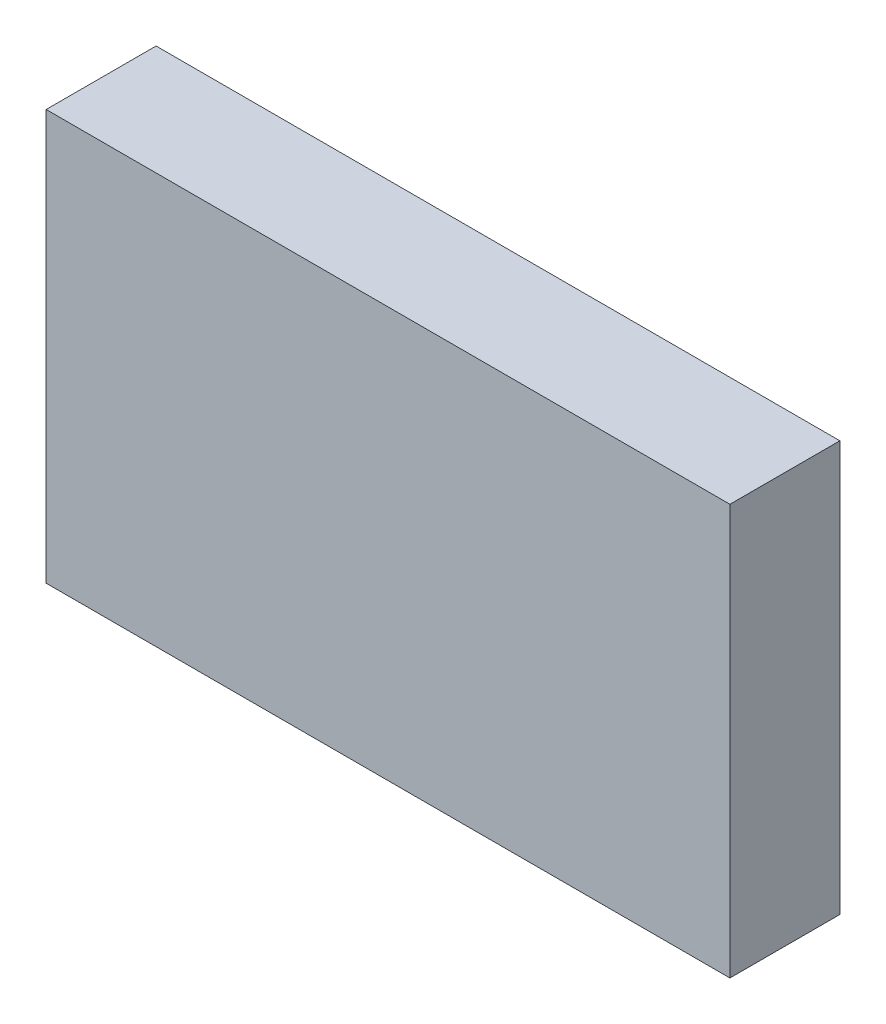
ISO-10303-21;
HEADER;
FILE_DESCRIPTION(('STEP AP214'),'2;1');
FILE_NAME('part.step','',(''),(''),'','','');
FILE_SCHEMA(('AUTOMOTIVE_DESIGN { 1 0 10303 214 1 1 1 1 }'));
ENDSEC;
DATA;
#1=APPLICATION_CONTEXT('core data for automotive mechanical design processes');
#2=APPLICATION_PROTOCOL_DEFINITION('international standard','automotive_design',2000,#1);
#3=PRODUCT_CONTEXT('',#1,'mechanical');
#4=PRODUCT('Part','Part','',(#3));
#5=PRODUCT_RELATED_PRODUCT_CATEGORY('part','',(#4));
#6=PRODUCT_DEFINITION_FORMATION('','',#4);
#7=PRODUCT_DEFINITION_CONTEXT('part definition',#1,'design');
#8=PRODUCT_DEFINITION('design','',#6,#7);
#9=PRODUCT_DEFINITION_SHAPE('','',#8);
#10=(LENGTH_UNIT() NAMED_UNIT(*) SI_UNIT(.MILLI.,.METRE.));
#11=(NAMED_UNIT(*) PLANE_ANGLE_UNIT() SI_UNIT($,.RADIAN.));
#12=(NAMED_UNIT(*) SI_UNIT($,.STERADIAN.) SOLID_ANGLE_UNIT());
#13=UNCERTAINTY_MEASURE_WITH_UNIT(LENGTH_MEASURE(1.E-05),#10,'distance_accuracy_value','');
#14=(GEOMETRIC_REPRESENTATION_CONTEXT(3) GLOBAL_UNCERTAINTY_ASSIGNED_CONTEXT((#13)) GLOBAL_UNIT_ASSIGNED_CONTEXT((#10,
#11,#12)) REPRESENTATION_CONTEXT('',''));
#15=CARTESIAN_POINT('',(0.,0.,0.));
#16=DIRECTION('',(0.,0.,1.));
#17=DIRECTION('',(1.,0.,0.));
#18=AXIS2_PLACEMENT_3D('',#15,#16,#17);
#19=CARTESIAN_POINT('',(12.5,7.5,4.02));
#20=DIRECTION('',(-1.,0.,0.));
#21=DIRECTION('',(0.,0.,1.));
#22=AXIS2_PLACEMENT_3D('',#19,#20,#21);
#23=PLANE('',#22);
#24=DIRECTION('',(0.,1.,0.));
#25=VECTOR('',#24,1.);
#26=CARTESIAN_POINT('',(12.5,7.5,0.));
#27=LINE('',#26,#25);
#28=CARTESIAN_POINT('',(12.5,-7.5,0.));
#29=VERTEX_POINT('',#28);
#30=CARTESIAN_POINT('',(12.5,7.5,0.));
#31=VERTEX_POINT('',#30);
#32=EDGE_CURVE('E96',#29,#31,#27,.T.);
#33=ORIENTED_EDGE('',*,*,#32,.T.);
#34=DIRECTION('',(0.,0.,-1.));
#35=VECTOR('',#34,1.);
#36=CARTESIAN_POINT('',(12.5,7.5,4.02));
#37=LINE('',#36,#35);
#38=CARTESIAN_POINT('',(12.5,7.5,4.02));
#39=VERTEX_POINT('',#38);
#40=EDGE_CURVE('E11',#39,#31,#37,.T.);
#41=ORIENTED_EDGE('',*,*,#40,.F.);
#42=DIRECTION('',(0.,1.,0.));
#43=VECTOR('',#42,1.);
#44=CARTESIAN_POINT('',(12.5,7.5,4.02));
#45=LINE('',#44,#43);
#46=CARTESIAN_POINT('',(12.5,-7.5,4.02));
#47=VERTEX_POINT('',#46);
#48=EDGE_CURVE('E84',#47,#39,#45,.T.);
#49=ORIENTED_EDGE('',*,*,#48,.F.);
#50=DIRECTION('',(0.,0.,-1.));
#51=VECTOR('',#50,1.);
#52=CARTESIAN_POINT('',(12.5,-7.5,4.02));
#53=LINE('',#52,#51);
#54=EDGE_CURVE('E92',#47,#29,#53,.T.);
#55=ORIENTED_EDGE('',*,*,#54,.T.);
#56=EDGE_LOOP('',(#33,#41,#49,#55));
#57=FACE_BOUND('',#56,.T.);
#58=ADVANCED_FACE('F33',(#57),#23,.F.);
#59=CARTESIAN_POINT('',(-12.5,7.5,4.02));
#60=DIRECTION('',(0.,-1.,0.));
#61=DIRECTION('',(0.,0.,-1.));
#62=AXIS2_PLACEMENT_3D('',#59,#60,#61);
#63=PLANE('',#62);
#64=DIRECTION('',(-1.,0.,0.));
#65=VECTOR('',#64,1.);
#66=CARTESIAN_POINT('',(-12.5,7.5,0.));
#67=LINE('',#66,#65);
#68=CARTESIAN_POINT('',(-12.5,7.5,0.));
#69=VERTEX_POINT('',#68);
#70=EDGE_CURVE('E88',#31,#69,#67,.T.);
#71=ORIENTED_EDGE('',*,*,#70,.T.);
#72=DIRECTION('',(0.,0.,-1.));
#73=VECTOR('',#72,1.);
#74=CARTESIAN_POINT('',(-12.5,7.5,4.02));
#75=LINE('',#74,#73);
#76=CARTESIAN_POINT('',(-12.5,7.5,4.02));
#77=VERTEX_POINT('',#76);
#78=EDGE_CURVE('E41',#77,#69,#75,.T.);
#79=ORIENTED_EDGE('',*,*,#78,.F.);
#80=DIRECTION('',(-1.,0.,0.));
#81=VECTOR('',#80,1.);
#82=CARTESIAN_POINT('',(-12.5,7.5,4.02));
#83=LINE('',#82,#81);
#84=EDGE_CURVE('E79',#39,#77,#83,.T.);
#85=ORIENTED_EDGE('',*,*,#84,.F.);
#86=ORIENTED_EDGE('',*,*,#40,.T.);
#87=EDGE_LOOP('',(#71,#79,#85,#86));
#88=FACE_BOUND('',#87,.T.);
#89=ADVANCED_FACE('F87',(#88),#63,.F.);
#90=CARTESIAN_POINT('',(-12.5,7.5,4.02));
#91=DIRECTION('',(1.,0.,0.));
#92=DIRECTION('',(0.,1.,0.));
#93=AXIS2_PLACEMENT_3D('',#90,#91,#92);
#94=PLANE('',#93);
#95=DIRECTION('',(0.,-1.,0.));
#96=VECTOR('',#95,1.);
#97=CARTESIAN_POINT('',(-12.5,7.5,0.));
#98=LINE('',#97,#96);
#99=CARTESIAN_POINT('',(-12.5,-7.5,0.));
#100=VERTEX_POINT('',#99);
#101=EDGE_CURVE('E66',#69,#100,#98,.T.);
#102=ORIENTED_EDGE('',*,*,#101,.T.);
#103=DIRECTION('',(0.,0.,-1.));
#104=VECTOR('',#103,1.);
#105=CARTESIAN_POINT('',(-12.5,-7.5,4.02));
#106=LINE('',#105,#104);
#107=CARTESIAN_POINT('',(-12.5,-7.5,4.02));
#108=VERTEX_POINT('',#107);
#109=EDGE_CURVE('E89',#108,#100,#106,.T.);
#110=ORIENTED_EDGE('',*,*,#109,.F.);
#111=DIRECTION('',(0.,-1.,0.));
#112=VECTOR('',#111,1.);
#113=CARTESIAN_POINT('',(-12.5,7.5,4.02));
#114=LINE('',#113,#112);
#115=EDGE_CURVE('E82',#77,#108,#114,.T.);
#116=ORIENTED_EDGE('',*,*,#115,.F.);
#117=ORIENTED_EDGE('',*,*,#78,.T.);
#118=EDGE_LOOP('',(#102,#110,#116,#117));
#119=FACE_BOUND('',#118,.T.);
#120=ADVANCED_FACE('F90',(#119),#94,.F.);
#121=CARTESIAN_POINT('',(-12.5,-7.5,4.02));
#122=DIRECTION('',(0.,1.,0.));
#123=DIRECTION('',(0.,0.,1.));
#124=AXIS2_PLACEMENT_3D('',#121,#122,#123);
#125=PLANE('',#124);
#126=DIRECTION('',(1.,0.,0.));
#127=VECTOR('',#126,1.);
#128=CARTESIAN_POINT('',(-12.5,-7.5,0.));
#129=LINE('',#128,#127);
#130=EDGE_CURVE('E72',#100,#29,#129,.T.);
#131=ORIENTED_EDGE('',*,*,#130,.T.);
#132=ORIENTED_EDGE('',*,*,#54,.F.);
#133=DIRECTION('',(1.,0.,0.));
#134=VECTOR('',#133,1.);
#135=CARTESIAN_POINT('',(-12.5,-7.5,4.02));
#136=LINE('',#135,#134);
#137=EDGE_CURVE('E49',#108,#47,#136,.T.);
#138=ORIENTED_EDGE('',*,*,#137,.F.);
#139=ORIENTED_EDGE('',*,*,#109,.T.);
#140=EDGE_LOOP('',(#131,#132,#138,#139));
#141=FACE_BOUND('',#140,.T.);
#142=ADVANCED_FACE('F103',(#141),#125,.F.);
#143=CARTESIAN_POINT('',(0.,0.,4.02));
#144=DIRECTION('',(0.,0.,1.));
#145=DIRECTION('',(1.,0.,0.));
#146=AXIS2_PLACEMENT_3D('',#143,#144,#145);
#147=PLANE('',#146);
#148=ORIENTED_EDGE('',*,*,#48,.T.);
#149=ORIENTED_EDGE('',*,*,#84,.T.);
#150=ORIENTED_EDGE('',*,*,#115,.T.);
#151=ORIENTED_EDGE('',*,*,#137,.T.);
#152=EDGE_LOOP('',(#148,#149,#150,#151));
#153=FACE_BOUND('',#152,.T.);
#154=ADVANCED_FACE('F80',(#153),#147,.T.);
#155=CARTESIAN_POINT('',(0.,0.,0.));
#156=DIRECTION('',(0.,0.,1.));
#157=DIRECTION('',(1.,0.,0.));
#158=AXIS2_PLACEMENT_3D('',#155,#156,#157);
#159=PLANE('',#158);
#160=ORIENTED_EDGE('',*,*,#32,.F.);
#161=ORIENTED_EDGE('',*,*,#130,.F.);
#162=ORIENTED_EDGE('',*,*,#101,.F.);
#163=ORIENTED_EDGE('',*,*,#70,.F.);
#164=EDGE_LOOP('',(#160,#161,#162,#163));
#165=FACE_BOUND('',#164,.T.);
#166=ADVANCED_FACE('F106',(#165),#159,.F.);
#167=CLOSED_SHELL('',(#58,#89,#120,#142,#154,#166));
#168=MANIFOLD_SOLID_BREP('B2',#167);
#169=ADVANCED_BREP_SHAPE_REPRESENTATION('',(#18,#168),#14);
#170=SHAPE_DEFINITION_REPRESENTATION(#9,#169);
ENDSEC;
END-ISO-10303-21;
